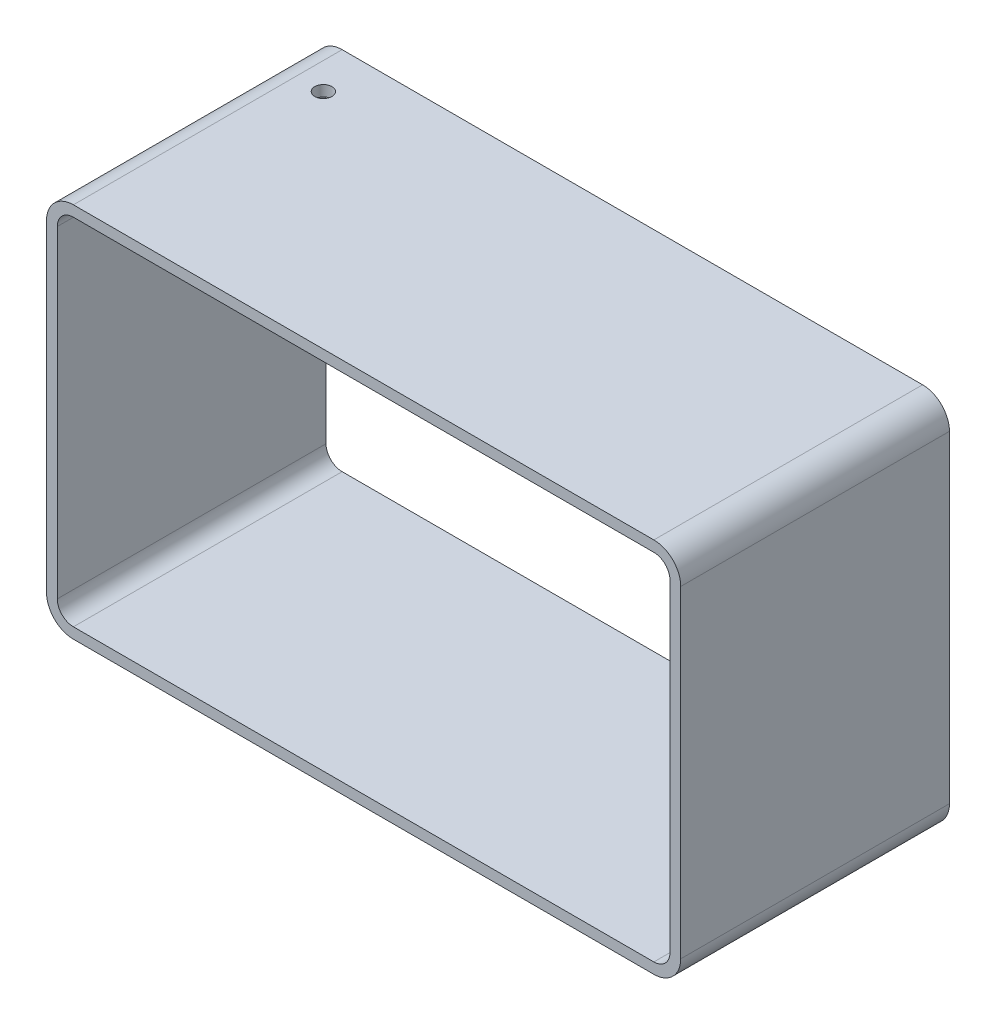
ISO-10303-21;
HEADER;
FILE_DESCRIPTION(('STEP AP214'),'2;1');
FILE_NAME('part.step','',(''),(''),'','','');
FILE_SCHEMA(('AUTOMOTIVE_DESIGN { 1 0 10303 214 1 1 1 1 }'));
ENDSEC;
DATA;
#1=APPLICATION_CONTEXT('core data for automotive mechanical design processes');
#2=APPLICATION_PROTOCOL_DEFINITION('international standard','automotive_design',2000,#1);
#3=PRODUCT_CONTEXT('',#1,'mechanical');
#4=PRODUCT('Part','Part','',(#3));
#5=PRODUCT_RELATED_PRODUCT_CATEGORY('part','',(#4));
#6=PRODUCT_DEFINITION_FORMATION('','',#4);
#7=PRODUCT_DEFINITION_CONTEXT('part definition',#1,'design');
#8=PRODUCT_DEFINITION('design','',#6,#7);
#9=PRODUCT_DEFINITION_SHAPE('','',#8);
#10=(LENGTH_UNIT() NAMED_UNIT(*) SI_UNIT(.MILLI.,.METRE.));
#11=(NAMED_UNIT(*) PLANE_ANGLE_UNIT() SI_UNIT($,.RADIAN.));
#12=(NAMED_UNIT(*) SI_UNIT($,.STERADIAN.) SOLID_ANGLE_UNIT());
#13=UNCERTAINTY_MEASURE_WITH_UNIT(LENGTH_MEASURE(1.E-05),#10,'distance_accuracy_value','');
#14=(GEOMETRIC_REPRESENTATION_CONTEXT(3) GLOBAL_UNCERTAINTY_ASSIGNED_CONTEXT((#13)) GLOBAL_UNIT_ASSIGNED_CONTEXT((#10,
#11,#12)) REPRESENTATION_CONTEXT('',''));
#15=CARTESIAN_POINT('',(0.,0.,0.));
#16=DIRECTION('',(0.,0.,1.));
#17=DIRECTION('',(1.,0.,0.));
#18=AXIS2_PLACEMENT_3D('',#15,#16,#17);
#19=CARTESIAN_POINT('',(59.,-35.,50.));
#20=DIRECTION('',(-1.,0.,0.));
#21=DIRECTION('',(0.,0.,1.));
#22=AXIS2_PLACEMENT_3D('',#19,#20,#21);
#23=PLANE('',#22);
#24=DIRECTION('',(0.,1.,0.));
#25=VECTOR('',#24,1.);
#26=CARTESIAN_POINT('',(59.,-35.,50.));
#27=LINE('',#26,#25);
#28=CARTESIAN_POINT('',(59.,-30.,50.));
#29=VERTEX_POINT('',#28);
#30=CARTESIAN_POINT('',(59.,30.,50.));
#31=VERTEX_POINT('',#30);
#32=EDGE_CURVE('E218',#29,#31,#27,.T.);
#33=ORIENTED_EDGE('',*,*,#32,.F.);
#34=DIRECTION('',(0.,0.,-1.));
#35=VECTOR('',#34,1.);
#36=CARTESIAN_POINT('',(59.,-30.,50.));
#37=LINE('',#36,#35);
#38=CARTESIAN_POINT('',(59.,-30.,0.));
#39=VERTEX_POINT('',#38);
#40=EDGE_CURVE('E243',#29,#39,#37,.T.);
#41=ORIENTED_EDGE('',*,*,#40,.T.);
#42=DIRECTION('',(0.,1.,0.));
#43=VECTOR('',#42,1.);
#44=CARTESIAN_POINT('',(59.,-35.,0.));
#45=LINE('',#44,#43);
#46=CARTESIAN_POINT('',(59.,30.,0.));
#47=VERTEX_POINT('',#46);
#48=EDGE_CURVE('E206',#39,#47,#45,.T.);
#49=ORIENTED_EDGE('',*,*,#48,.T.);
#50=DIRECTION('',(0.,0.,-1.));
#51=VECTOR('',#50,1.);
#52=CARTESIAN_POINT('',(59.,30.,50.));
#53=LINE('',#52,#51);
#54=EDGE_CURVE('E231',#47,#31,#53,.F.);
#55=ORIENTED_EDGE('',*,*,#54,.T.);
#56=EDGE_LOOP('',(#33,#41,#49,#55));
#57=FACE_BOUND('',#56,.T.);
#58=ADVANCED_FACE('F33',(#57),#23,.F.);
#59=CARTESIAN_POINT('',(-59.,35.,50.));
#60=DIRECTION('',(0.,-1.,0.));
#61=DIRECTION('',(0.,0.,-1.));
#62=AXIS2_PLACEMENT_3D('',#59,#60,#61);
#63=PLANE('',#62);
#64=CARTESIAN_POINT('',(-49.,35.,8.5));
#65=DIRECTION('',(0.,1.,0.));
#66=DIRECTION('',(0.,0.,1.));
#67=AXIS2_PLACEMENT_3D('',#64,#65,#66);
#68=CIRCLE('',#67,1.6);
#69=CARTESIAN_POINT('',(-49.,35.,10.1));
#70=VERTEX_POINT('',#69);
#71=EDGE_CURVE('E489',#70,#70,#68,.T.);
#72=ORIENTED_EDGE('',*,*,#71,.F.);
#73=EDGE_LOOP('',(#72));
#74=FACE_BOUND('',#73,.T.);
#75=DIRECTION('',(-1.,0.,0.));
#76=VECTOR('',#75,1.);
#77=CARTESIAN_POINT('',(-59.,35.,0.));
#78=LINE('',#77,#76);
#79=CARTESIAN_POINT('',(54.,35.,0.));
#80=VERTEX_POINT('',#79);
#81=CARTESIAN_POINT('',(-54.,35.,0.));
#82=VERTEX_POINT('',#81);
#83=EDGE_CURVE('E234',#80,#82,#78,.T.);
#84=ORIENTED_EDGE('',*,*,#83,.T.);
#85=DIRECTION('',(0.,0.,-1.));
#86=VECTOR('',#85,1.);
#87=CARTESIAN_POINT('',(-54.,35.,50.));
#88=LINE('',#87,#86);
#89=CARTESIAN_POINT('',(-54.,35.,50.));
#90=VERTEX_POINT('',#89);
#91=EDGE_CURVE('E11',#82,#90,#88,.F.);
#92=ORIENTED_EDGE('',*,*,#91,.T.);
#93=DIRECTION('',(-1.,0.,0.));
#94=VECTOR('',#93,1.);
#95=CARTESIAN_POINT('',(-59.,35.,50.));
#96=LINE('',#95,#94);
#97=CARTESIAN_POINT('',(54.,35.,50.));
#98=VERTEX_POINT('',#97);
#99=EDGE_CURVE('E221',#98,#90,#96,.T.);
#100=ORIENTED_EDGE('',*,*,#99,.F.);
#101=DIRECTION('',(0.,0.,-1.));
#102=VECTOR('',#101,1.);
#103=CARTESIAN_POINT('',(54.,35.,50.));
#104=LINE('',#103,#102);
#105=EDGE_CURVE('E42',#98,#80,#104,.T.);
#106=ORIENTED_EDGE('',*,*,#105,.T.);
#107=EDGE_LOOP('',(#84,#92,#100,#106));
#108=FACE_BOUND('',#107,.T.);
#109=ADVANCED_FACE('F277',(#74,#108),#63,.F.);
#110=CARTESIAN_POINT('',(-59.,-35.,50.));
#111=DIRECTION('',(1.,0.,0.));
#112=DIRECTION('',(0.,0.,-1.));
#113=AXIS2_PLACEMENT_3D('',#110,#111,#112);
#114=PLANE('',#113);
#115=DIRECTION('',(0.,-1.,0.));
#116=VECTOR('',#115,1.);
#117=CARTESIAN_POINT('',(-59.,-35.,0.));
#118=LINE('',#117,#116);
#119=CARTESIAN_POINT('',(-59.,30.,0.));
#120=VERTEX_POINT('',#119);
#121=CARTESIAN_POINT('',(-59.,-30.,0.));
#122=VERTEX_POINT('',#121);
#123=EDGE_CURVE('E237',#120,#122,#118,.T.);
#124=ORIENTED_EDGE('',*,*,#123,.T.);
#125=DIRECTION('',(0.,0.,-1.));
#126=VECTOR('',#125,1.);
#127=CARTESIAN_POINT('',(-59.,-30.,50.));
#128=LINE('',#127,#126);
#129=CARTESIAN_POINT('',(-59.,-30.,50.));
#130=VERTEX_POINT('',#129);
#131=EDGE_CURVE('E270',#122,#130,#128,.F.);
#132=ORIENTED_EDGE('',*,*,#131,.T.);
#133=DIRECTION('',(0.,-1.,0.));
#134=VECTOR('',#133,1.);
#135=CARTESIAN_POINT('',(-59.,-35.,50.));
#136=LINE('',#135,#134);
#137=CARTESIAN_POINT('',(-59.,30.,50.));
#138=VERTEX_POINT('',#137);
#139=EDGE_CURVE('E225',#138,#130,#136,.T.);
#140=ORIENTED_EDGE('',*,*,#139,.F.);
#141=DIRECTION('',(0.,0.,-1.));
#142=VECTOR('',#141,1.);
#143=CARTESIAN_POINT('',(-59.,30.,50.));
#144=LINE('',#143,#142);
#145=EDGE_CURVE('E267',#138,#120,#144,.T.);
#146=ORIENTED_EDGE('',*,*,#145,.T.);
#147=EDGE_LOOP('',(#124,#132,#140,#146));
#148=FACE_BOUND('',#147,.T.);
#149=ADVANCED_FACE('F289',(#148),#114,.F.);
#150=CARTESIAN_POINT('',(-59.,-35.,50.));
#151=DIRECTION('',(0.,1.,0.));
#152=DIRECTION('',(0.,0.,1.));
#153=AXIS2_PLACEMENT_3D('',#150,#151,#152);
#154=PLANE('',#153);
#155=CARTESIAN_POINT('',(49.,-35.,8.5));
#156=DIRECTION('',(0.,-1.,0.));
#157=DIRECTION('',(0.,0.,-1.));
#158=AXIS2_PLACEMENT_3D('',#155,#156,#157);
#159=CIRCLE('',#158,1.6);
#160=CARTESIAN_POINT('',(49.,-35.,6.9));
#161=VERTEX_POINT('',#160);
#162=EDGE_CURVE('E171',#161,#161,#159,.T.);
#163=ORIENTED_EDGE('',*,*,#162,.F.);
#164=EDGE_LOOP('',(#163));
#165=FACE_BOUND('',#164,.T.);
#166=DIRECTION('',(1.,0.,0.));
#167=VECTOR('',#166,1.);
#168=CARTESIAN_POINT('',(-59.,-35.,0.));
#169=LINE('',#168,#167);
#170=CARTESIAN_POINT('',(-54.,-35.,0.));
#171=VERTEX_POINT('',#170);
#172=CARTESIAN_POINT('',(54.,-35.,0.));
#173=VERTEX_POINT('',#172);
#174=EDGE_CURVE('E222',#171,#173,#169,.T.);
#175=ORIENTED_EDGE('',*,*,#174,.T.);
#176=DIRECTION('',(0.,0.,-1.));
#177=VECTOR('',#176,1.);
#178=CARTESIAN_POINT('',(54.,-35.,50.));
#179=LINE('',#178,#177);
#180=CARTESIAN_POINT('',(54.,-35.,50.));
#181=VERTEX_POINT('',#180);
#182=EDGE_CURVE('E257',#173,#181,#179,.F.);
#183=ORIENTED_EDGE('',*,*,#182,.T.);
#184=DIRECTION('',(1.,0.,0.));
#185=VECTOR('',#184,1.);
#186=CARTESIAN_POINT('',(-59.,-35.,50.));
#187=LINE('',#186,#185);
#188=CARTESIAN_POINT('',(-54.,-35.,50.));
#189=VERTEX_POINT('',#188);
#190=EDGE_CURVE('E228',#189,#181,#187,.T.);
#191=ORIENTED_EDGE('',*,*,#190,.F.);
#192=DIRECTION('',(0.,0.,-1.));
#193=VECTOR('',#192,1.);
#194=CARTESIAN_POINT('',(-54.,-35.,50.));
#195=LINE('',#194,#193);
#196=EDGE_CURVE('E254',#189,#171,#195,.T.);
#197=ORIENTED_EDGE('',*,*,#196,.T.);
#198=EDGE_LOOP('',(#175,#183,#191,#197));
#199=FACE_BOUND('',#198,.T.);
#200=ADVANCED_FACE('F300',(#165,#199),#154,.F.);
#201=CARTESIAN_POINT('',(0.,0.,50.));
#202=DIRECTION('',(0.,0.,-1.));
#203=DIRECTION('',(-1.,0.,0.));
#204=AXIS2_PLACEMENT_3D('',#201,#202,#203);
#205=PLANE('',#204);
#206=DIRECTION('',(1.,0.,0.));
#207=VECTOR('',#206,1.);
#208=CARTESIAN_POINT('',(-54.,-33.,50.));
#209=LINE('',#208,#207);
#210=CARTESIAN_POINT('',(-54.,-33.,50.));
#211=VERTEX_POINT('',#210);
#212=CARTESIAN_POINT('',(54.,-33.,50.));
#213=VERTEX_POINT('',#212);
#214=EDGE_CURVE('E188',#211,#213,#209,.T.);
#215=ORIENTED_EDGE('',*,*,#214,.F.);
#216=CARTESIAN_POINT('',(-54.,-30.,50.));
#217=DIRECTION('',(0.,0.,1.));
#218=DIRECTION('',(1.,0.,0.));
#219=AXIS2_PLACEMENT_3D('',#216,#217,#218);
#220=CIRCLE('',#219,3.);
#221=CARTESIAN_POINT('',(-57.,-30.,50.));
#222=VERTEX_POINT('',#221);
#223=EDGE_CURVE('E49',#222,#211,#220,.T.);
#224=ORIENTED_EDGE('',*,*,#223,.F.);
#225=DIRECTION('',(0.,-1.,0.));
#226=VECTOR('',#225,1.);
#227=CARTESIAN_POINT('',(-57.,30.,50.));
#228=LINE('',#227,#226);
#229=CARTESIAN_POINT('',(-57.,30.,50.));
#230=VERTEX_POINT('',#229);
#231=EDGE_CURVE('E165',#230,#222,#228,.T.);
#232=ORIENTED_EDGE('',*,*,#231,.F.);
#233=CARTESIAN_POINT('',(-54.,30.,50.));
#234=DIRECTION('',(0.,0.,1.));
#235=DIRECTION('',(1.,0.,0.));
#236=AXIS2_PLACEMENT_3D('',#233,#234,#235);
#237=CIRCLE('',#236,3.);
#238=CARTESIAN_POINT('',(-54.,33.,50.));
#239=VERTEX_POINT('',#238);
#240=EDGE_CURVE('E168',#239,#230,#237,.T.);
#241=ORIENTED_EDGE('',*,*,#240,.F.);
#242=DIRECTION('',(-1.,0.,0.));
#243=VECTOR('',#242,1.);
#244=CARTESIAN_POINT('',(54.,33.,50.));
#245=LINE('',#244,#243);
#246=CARTESIAN_POINT('',(54.,33.,50.));
#247=VERTEX_POINT('',#246);
#248=EDGE_CURVE('E199',#247,#239,#245,.T.);
#249=ORIENTED_EDGE('',*,*,#248,.F.);
#250=CARTESIAN_POINT('',(54.,30.,50.));
#251=DIRECTION('',(0.,0.,1.));
#252=DIRECTION('',(1.,0.,0.));
#253=AXIS2_PLACEMENT_3D('',#250,#251,#252);
#254=CIRCLE('',#253,3.);
#255=CARTESIAN_POINT('',(57.,30.,50.));
#256=VERTEX_POINT('',#255);
#257=EDGE_CURVE('E196',#256,#247,#254,.T.);
#258=ORIENTED_EDGE('',*,*,#257,.F.);
#259=DIRECTION('',(0.,1.,0.));
#260=VECTOR('',#259,1.);
#261=CARTESIAN_POINT('',(57.,-30.,50.));
#262=LINE('',#261,#260);
#263=CARTESIAN_POINT('',(57.,-30.,50.));
#264=VERTEX_POINT('',#263);
#265=EDGE_CURVE('E193',#264,#256,#262,.T.);
#266=ORIENTED_EDGE('',*,*,#265,.F.);
#267=CARTESIAN_POINT('',(54.,-30.,50.));
#268=DIRECTION('',(0.,0.,1.));
#269=DIRECTION('',(1.,0.,0.));
#270=AXIS2_PLACEMENT_3D('',#267,#268,#269);
#271=CIRCLE('',#270,3.);
#272=EDGE_CURVE('E190',#213,#264,#271,.T.);
#273=ORIENTED_EDGE('',*,*,#272,.F.);
#274=EDGE_LOOP('',(#215,#224,#232,#241,#249,#258,#266,#273));
#275=FACE_BOUND('',#274,.T.);
#276=ORIENTED_EDGE('',*,*,#190,.T.);
#277=CARTESIAN_POINT('',(54.,-30.,50.));
#278=DIRECTION('',(0.,0.,-1.));
#279=DIRECTION('',(-1.,0.,0.));
#280=AXIS2_PLACEMENT_3D('',#277,#278,#279);
#281=CIRCLE('',#280,5.);
#282=EDGE_CURVE('E265',#181,#29,#281,.F.);
#283=ORIENTED_EDGE('',*,*,#282,.T.);
#284=ORIENTED_EDGE('',*,*,#32,.T.);
#285=CARTESIAN_POINT('',(54.,30.,50.));
#286=DIRECTION('',(0.,0.,-1.));
#287=DIRECTION('',(-1.,0.,0.));
#288=AXIS2_PLACEMENT_3D('',#285,#286,#287);
#289=CIRCLE('',#288,5.);
#290=EDGE_CURVE('E259',#31,#98,#289,.F.);
#291=ORIENTED_EDGE('',*,*,#290,.T.);
#292=ORIENTED_EDGE('',*,*,#99,.T.);
#293=CARTESIAN_POINT('',(-54.,30.,50.));
#294=DIRECTION('',(0.,0.,-1.));
#295=DIRECTION('',(-1.,0.,0.));
#296=AXIS2_PLACEMENT_3D('',#293,#294,#295);
#297=CIRCLE('',#296,5.);
#298=EDGE_CURVE('E261',#90,#138,#297,.F.);
#299=ORIENTED_EDGE('',*,*,#298,.T.);
#300=ORIENTED_EDGE('',*,*,#139,.T.);
#301=CARTESIAN_POINT('',(-54.,-30.,50.));
#302=DIRECTION('',(0.,0.,-1.));
#303=DIRECTION('',(-1.,0.,0.));
#304=AXIS2_PLACEMENT_3D('',#301,#302,#303);
#305=CIRCLE('',#304,5.);
#306=EDGE_CURVE('E263',#130,#189,#305,.F.);
#307=ORIENTED_EDGE('',*,*,#306,.T.);
#308=EDGE_LOOP('',(#276,#283,#284,#291,#292,#299,#300,#307));
#309=FACE_BOUND('',#308,.T.);
#310=ADVANCED_FACE('F293',(#275,#309),#205,.F.);
#311=CARTESIAN_POINT('',(0.,0.,0.));
#312=DIRECTION('',(0.,0.,-1.));
#313=DIRECTION('',(-1.,0.,0.));
#314=AXIS2_PLACEMENT_3D('',#311,#312,#313);
#315=PLANE('',#314);
#316=CARTESIAN_POINT('',(-54.,-30.,0.));
#317=DIRECTION('',(0.,0.,1.));
#318=DIRECTION('',(1.,0.,0.));
#319=AXIS2_PLACEMENT_3D('',#316,#317,#318);
#320=CIRCLE('',#319,3.);
#321=CARTESIAN_POINT('',(-57.,-30.,0.));
#322=VERTEX_POINT('',#321);
#323=CARTESIAN_POINT('',(-54.,-33.,0.));
#324=VERTEX_POINT('',#323);
#325=EDGE_CURVE('E148',#322,#324,#320,.T.);
#326=ORIENTED_EDGE('',*,*,#325,.T.);
#327=DIRECTION('',(1.,0.,0.));
#328=VECTOR('',#327,1.);
#329=CARTESIAN_POINT('',(-54.,-33.,0.));
#330=LINE('',#329,#328);
#331=CARTESIAN_POINT('',(54.,-33.,0.));
#332=VERTEX_POINT('',#331);
#333=EDGE_CURVE('E157',#324,#332,#330,.T.);
#334=ORIENTED_EDGE('',*,*,#333,.T.);
#335=CARTESIAN_POINT('',(54.,-30.,0.));
#336=DIRECTION('',(0.,0.,1.));
#337=DIRECTION('',(1.,0.,0.));
#338=AXIS2_PLACEMENT_3D('',#335,#336,#337);
#339=CIRCLE('',#338,3.);
#340=CARTESIAN_POINT('',(57.,-30.,0.));
#341=VERTEX_POINT('',#340);
#342=EDGE_CURVE('E57',#332,#341,#339,.T.);
#343=ORIENTED_EDGE('',*,*,#342,.T.);
#344=DIRECTION('',(0.,1.,0.));
#345=VECTOR('',#344,1.);
#346=CARTESIAN_POINT('',(57.,-30.,0.));
#347=LINE('',#346,#345);
#348=CARTESIAN_POINT('',(57.,30.,0.));
#349=VERTEX_POINT('',#348);
#350=EDGE_CURVE('E175',#341,#349,#347,.T.);
#351=ORIENTED_EDGE('',*,*,#350,.T.);
#352=CARTESIAN_POINT('',(54.,30.,0.));
#353=DIRECTION('',(0.,0.,1.));
#354=DIRECTION('',(1.,0.,0.));
#355=AXIS2_PLACEMENT_3D('',#352,#353,#354);
#356=CIRCLE('',#355,3.);
#357=CARTESIAN_POINT('',(54.,33.,0.));
#358=VERTEX_POINT('',#357);
#359=EDGE_CURVE('E178',#349,#358,#356,.T.);
#360=ORIENTED_EDGE('',*,*,#359,.T.);
#361=DIRECTION('',(-1.,0.,0.));
#362=VECTOR('',#361,1.);
#363=CARTESIAN_POINT('',(54.,33.,0.));
#364=LINE('',#363,#362);
#365=CARTESIAN_POINT('',(-54.,33.,0.));
#366=VERTEX_POINT('',#365);
#367=EDGE_CURVE('E181',#358,#366,#364,.T.);
#368=ORIENTED_EDGE('',*,*,#367,.T.);
#369=CARTESIAN_POINT('',(-54.,30.,0.));
#370=DIRECTION('',(0.,0.,1.));
#371=DIRECTION('',(1.,0.,0.));
#372=AXIS2_PLACEMENT_3D('',#369,#370,#371);
#373=CIRCLE('',#372,3.);
#374=CARTESIAN_POINT('',(-57.,30.,0.));
#375=VERTEX_POINT('',#374);
#376=EDGE_CURVE('E184',#366,#375,#373,.T.);
#377=ORIENTED_EDGE('',*,*,#376,.T.);
#378=DIRECTION('',(0.,-1.,0.));
#379=VECTOR('',#378,1.);
#380=CARTESIAN_POINT('',(-57.,30.,0.));
#381=LINE('',#380,#379);
#382=EDGE_CURVE('E154',#375,#322,#381,.T.);
#383=ORIENTED_EDGE('',*,*,#382,.T.);
#384=EDGE_LOOP('',(#326,#334,#343,#351,#360,#368,#377,#383));
#385=FACE_BOUND('',#384,.T.);
#386=ORIENTED_EDGE('',*,*,#48,.F.);
#387=CARTESIAN_POINT('',(54.,-30.,0.));
#388=DIRECTION('',(0.,0.,-1.));
#389=DIRECTION('',(-1.,0.,0.));
#390=AXIS2_PLACEMENT_3D('',#387,#388,#389);
#391=CIRCLE('',#390,5.);
#392=EDGE_CURVE('E252',#39,#173,#391,.T.);
#393=ORIENTED_EDGE('',*,*,#392,.T.);
#394=ORIENTED_EDGE('',*,*,#174,.F.);
#395=CARTESIAN_POINT('',(-54.,-30.,0.));
#396=DIRECTION('',(0.,0.,-1.));
#397=DIRECTION('',(-1.,0.,0.));
#398=AXIS2_PLACEMENT_3D('',#395,#396,#397);
#399=CIRCLE('',#398,5.);
#400=EDGE_CURVE('E250',#171,#122,#399,.T.);
#401=ORIENTED_EDGE('',*,*,#400,.T.);
#402=ORIENTED_EDGE('',*,*,#123,.F.);
#403=CARTESIAN_POINT('',(-54.,30.,0.));
#404=DIRECTION('',(0.,0.,-1.));
#405=DIRECTION('',(-1.,0.,0.));
#406=AXIS2_PLACEMENT_3D('',#403,#404,#405);
#407=CIRCLE('',#406,5.);
#408=EDGE_CURVE('E248',#120,#82,#407,.T.);
#409=ORIENTED_EDGE('',*,*,#408,.T.);
#410=ORIENTED_EDGE('',*,*,#83,.F.);
#411=CARTESIAN_POINT('',(54.,30.,0.));
#412=DIRECTION('',(0.,0.,-1.));
#413=DIRECTION('',(-1.,0.,0.));
#414=AXIS2_PLACEMENT_3D('',#411,#412,#413);
#415=CIRCLE('',#414,5.);
#416=EDGE_CURVE('E246',#80,#47,#415,.T.);
#417=ORIENTED_EDGE('',*,*,#416,.T.);
#418=EDGE_LOOP('',(#386,#393,#394,#401,#402,#409,#410,#417));
#419=FACE_BOUND('',#418,.T.);
#420=ADVANCED_FACE('F161',(#385,#419),#315,.T.);
#421=CARTESIAN_POINT('',(54.,-30.,50.));
#422=DIRECTION('',(0.,0.,-1.));
#423=DIRECTION('',(-1.,0.,0.));
#424=AXIS2_PLACEMENT_3D('',#421,#422,#423);
#425=CYLINDRICAL_SURFACE('',#424,5.);
#426=ORIENTED_EDGE('',*,*,#282,.F.);
#427=ORIENTED_EDGE('',*,*,#182,.F.);
#428=ORIENTED_EDGE('',*,*,#392,.F.);
#429=ORIENTED_EDGE('',*,*,#40,.F.);
#430=EDGE_LOOP('',(#426,#427,#428,#429));
#431=FACE_BOUND('',#430,.T.);
#432=ADVANCED_FACE('F305',(#431),#425,.T.);
#433=CARTESIAN_POINT('',(-54.,-30.,50.));
#434=DIRECTION('',(0.,0.,-1.));
#435=DIRECTION('',(-1.,0.,0.));
#436=AXIS2_PLACEMENT_3D('',#433,#434,#435);
#437=CYLINDRICAL_SURFACE('',#436,5.);
#438=ORIENTED_EDGE('',*,*,#306,.F.);
#439=ORIENTED_EDGE('',*,*,#131,.F.);
#440=ORIENTED_EDGE('',*,*,#400,.F.);
#441=ORIENTED_EDGE('',*,*,#196,.F.);
#442=EDGE_LOOP('',(#438,#439,#440,#441));
#443=FACE_BOUND('',#442,.T.);
#444=ADVANCED_FACE('F297',(#443),#437,.T.);
#445=CARTESIAN_POINT('',(-54.,30.,50.));
#446=DIRECTION('',(0.,0.,-1.));
#447=DIRECTION('',(-1.,0.,0.));
#448=AXIS2_PLACEMENT_3D('',#445,#446,#447);
#449=CYLINDRICAL_SURFACE('',#448,5.);
#450=ORIENTED_EDGE('',*,*,#298,.F.);
#451=ORIENTED_EDGE('',*,*,#91,.F.);
#452=ORIENTED_EDGE('',*,*,#408,.F.);
#453=ORIENTED_EDGE('',*,*,#145,.F.);
#454=EDGE_LOOP('',(#450,#451,#452,#453));
#455=FACE_BOUND('',#454,.T.);
#456=ADVANCED_FACE('F286',(#455),#449,.T.);
#457=CARTESIAN_POINT('',(54.,30.,50.));
#458=DIRECTION('',(0.,0.,-1.));
#459=DIRECTION('',(-1.,0.,0.));
#460=AXIS2_PLACEMENT_3D('',#457,#458,#459);
#461=CYLINDRICAL_SURFACE('',#460,5.);
#462=ORIENTED_EDGE('',*,*,#290,.F.);
#463=ORIENTED_EDGE('',*,*,#54,.F.);
#464=ORIENTED_EDGE('',*,*,#416,.F.);
#465=ORIENTED_EDGE('',*,*,#105,.F.);
#466=EDGE_LOOP('',(#462,#463,#464,#465));
#467=FACE_BOUND('',#466,.T.);
#468=ADVANCED_FACE('F35',(#467),#461,.T.);
#469=CARTESIAN_POINT('',(-54.,-30.,0.));
#470=DIRECTION('',(0.,0.,1.));
#471=DIRECTION('',(1.,0.,0.));
#472=AXIS2_PLACEMENT_3D('',#469,#470,#471);
#473=CYLINDRICAL_SURFACE('',#472,3.);
#474=ORIENTED_EDGE('',*,*,#223,.T.);
#475=DIRECTION('',(0.,0.,1.));
#476=VECTOR('',#475,1.);
#477=CARTESIAN_POINT('',(-54.,-33.,0.));
#478=LINE('',#477,#476);
#479=EDGE_CURVE('E144',#324,#211,#478,.T.);
#480=ORIENTED_EDGE('',*,*,#479,.F.);
#481=ORIENTED_EDGE('',*,*,#325,.F.);
#482=DIRECTION('',(0.,0.,1.));
#483=VECTOR('',#482,1.);
#484=CARTESIAN_POINT('',(-57.,-30.,0.));
#485=LINE('',#484,#483);
#486=EDGE_CURVE('E204',#322,#222,#485,.T.);
#487=ORIENTED_EDGE('',*,*,#486,.T.);
#488=EDGE_LOOP('',(#474,#480,#481,#487));
#489=FACE_BOUND('',#488,.T.);
#490=ADVANCED_FACE('F146',(#489),#473,.F.);
#491=CARTESIAN_POINT('',(-57.,30.,0.));
#492=DIRECTION('',(-1.,0.,0.));
#493=DIRECTION('',(0.,-1.,0.));
#494=AXIS2_PLACEMENT_3D('',#491,#492,#493);
#495=PLANE('',#494);
#496=ORIENTED_EDGE('',*,*,#231,.T.);
#497=ORIENTED_EDGE('',*,*,#486,.F.);
#498=ORIENTED_EDGE('',*,*,#382,.F.);
#499=DIRECTION('',(0.,0.,1.));
#500=VECTOR('',#499,1.);
#501=CARTESIAN_POINT('',(-57.,30.,0.));
#502=LINE('',#501,#500);
#503=EDGE_CURVE('E207',#375,#230,#502,.T.);
#504=ORIENTED_EDGE('',*,*,#503,.T.);
#505=EDGE_LOOP('',(#496,#497,#498,#504));
#506=FACE_BOUND('',#505,.T.);
#507=ADVANCED_FACE('F314',(#506),#495,.F.);
#508=CARTESIAN_POINT('',(-54.,30.,0.));
#509=DIRECTION('',(0.,0.,1.));
#510=DIRECTION('',(1.,0.,0.));
#511=AXIS2_PLACEMENT_3D('',#508,#509,#510);
#512=CYLINDRICAL_SURFACE('',#511,3.);
#513=ORIENTED_EDGE('',*,*,#240,.T.);
#514=ORIENTED_EDGE('',*,*,#503,.F.);
#515=ORIENTED_EDGE('',*,*,#376,.F.);
#516=DIRECTION('',(0.,0.,1.));
#517=VECTOR('',#516,1.);
#518=CARTESIAN_POINT('',(-54.,33.,0.));
#519=LINE('',#518,#517);
#520=EDGE_CURVE('E209',#366,#239,#519,.T.);
#521=ORIENTED_EDGE('',*,*,#520,.T.);
#522=EDGE_LOOP('',(#513,#514,#515,#521));
#523=FACE_BOUND('',#522,.T.);
#524=ADVANCED_FACE('F375',(#523),#512,.F.);
#525=CARTESIAN_POINT('',(54.,33.,0.));
#526=DIRECTION('',(0.,1.,0.));
#527=DIRECTION('',(0.,0.,1.));
#528=AXIS2_PLACEMENT_3D('',#525,#526,#527);
#529=PLANE('',#528);
#530=CARTESIAN_POINT('',(-49.,33.,8.5));
#531=DIRECTION('',(0.,1.,0.));
#532=DIRECTION('',(0.,0.,1.));
#533=AXIS2_PLACEMENT_3D('',#530,#531,#532);
#534=CIRCLE('',#533,1.6);
#535=CARTESIAN_POINT('',(-49.,33.,10.1));
#536=VERTEX_POINT('',#535);
#537=EDGE_CURVE('E37',#536,#536,#534,.T.);
#538=ORIENTED_EDGE('',*,*,#537,.T.);
#539=EDGE_LOOP('',(#538));
#540=FACE_BOUND('',#539,.T.);
#541=ORIENTED_EDGE('',*,*,#248,.T.);
#542=ORIENTED_EDGE('',*,*,#520,.F.);
#543=ORIENTED_EDGE('',*,*,#367,.F.);
#544=DIRECTION('',(0.,0.,1.));
#545=VECTOR('',#544,1.);
#546=CARTESIAN_POINT('',(54.,33.,0.));
#547=LINE('',#546,#545);
#548=EDGE_CURVE('E211',#358,#247,#547,.T.);
#549=ORIENTED_EDGE('',*,*,#548,.T.);
#550=EDGE_LOOP('',(#541,#542,#543,#549));
#551=FACE_BOUND('',#550,.T.);
#552=ADVANCED_FACE('F385',(#540,#551),#529,.F.);
#553=CARTESIAN_POINT('',(54.,30.,0.));
#554=DIRECTION('',(0.,0.,1.));
#555=DIRECTION('',(1.,0.,0.));
#556=AXIS2_PLACEMENT_3D('',#553,#554,#555);
#557=CYLINDRICAL_SURFACE('',#556,3.);
#558=ORIENTED_EDGE('',*,*,#257,.T.);
#559=ORIENTED_EDGE('',*,*,#548,.F.);
#560=ORIENTED_EDGE('',*,*,#359,.F.);
#561=DIRECTION('',(0.,0.,1.));
#562=VECTOR('',#561,1.);
#563=CARTESIAN_POINT('',(57.,30.,0.));
#564=LINE('',#563,#562);
#565=EDGE_CURVE('E213',#349,#256,#564,.T.);
#566=ORIENTED_EDGE('',*,*,#565,.T.);
#567=EDGE_LOOP('',(#558,#559,#560,#566));
#568=FACE_BOUND('',#567,.T.);
#569=ADVANCED_FACE('F393',(#568),#557,.F.);
#570=CARTESIAN_POINT('',(57.,-30.,0.));
#571=DIRECTION('',(1.,0.,0.));
#572=DIRECTION('',(0.,1.,0.));
#573=AXIS2_PLACEMENT_3D('',#570,#571,#572);
#574=PLANE('',#573);
#575=ORIENTED_EDGE('',*,*,#265,.T.);
#576=ORIENTED_EDGE('',*,*,#565,.F.);
#577=ORIENTED_EDGE('',*,*,#350,.F.);
#578=DIRECTION('',(0.,0.,1.));
#579=VECTOR('',#578,1.);
#580=CARTESIAN_POINT('',(57.,-30.,0.));
#581=LINE('',#580,#579);
#582=EDGE_CURVE('E215',#341,#264,#581,.T.);
#583=ORIENTED_EDGE('',*,*,#582,.T.);
#584=EDGE_LOOP('',(#575,#576,#577,#583));
#585=FACE_BOUND('',#584,.T.);
#586=ADVANCED_FACE('F398',(#585),#574,.F.);
#587=CARTESIAN_POINT('',(54.,-30.,0.));
#588=DIRECTION('',(0.,0.,1.));
#589=DIRECTION('',(1.,0.,0.));
#590=AXIS2_PLACEMENT_3D('',#587,#588,#589);
#591=CYLINDRICAL_SURFACE('',#590,3.);
#592=ORIENTED_EDGE('',*,*,#272,.T.);
#593=ORIENTED_EDGE('',*,*,#582,.F.);
#594=ORIENTED_EDGE('',*,*,#342,.F.);
#595=DIRECTION('',(0.,0.,1.));
#596=VECTOR('',#595,1.);
#597=CARTESIAN_POINT('',(54.,-33.,0.));
#598=LINE('',#597,#596);
#599=EDGE_CURVE('E153',#332,#213,#598,.T.);
#600=ORIENTED_EDGE('',*,*,#599,.T.);
#601=EDGE_LOOP('',(#592,#593,#594,#600));
#602=FACE_BOUND('',#601,.T.);
#603=ADVANCED_FACE('F408',(#602),#591,.F.);
#604=CARTESIAN_POINT('',(-54.,-33.,0.));
#605=DIRECTION('',(0.,-1.,0.));
#606=DIRECTION('',(0.,0.,-1.));
#607=AXIS2_PLACEMENT_3D('',#604,#605,#606);
#608=PLANE('',#607);
#609=CARTESIAN_POINT('',(49.,-33.,8.5));
#610=DIRECTION('',(0.,-1.,0.));
#611=DIRECTION('',(0.,0.,-1.));
#612=AXIS2_PLACEMENT_3D('',#609,#610,#611);
#613=CIRCLE('',#612,1.6);
#614=CARTESIAN_POINT('',(49.,-33.,6.9));
#615=VERTEX_POINT('',#614);
#616=EDGE_CURVE('E492',#615,#615,#613,.F.);
#617=ORIENTED_EDGE('',*,*,#616,.F.);
#618=EDGE_LOOP('',(#617));
#619=FACE_BOUND('',#618,.T.);
#620=ORIENTED_EDGE('',*,*,#214,.T.);
#621=ORIENTED_EDGE('',*,*,#599,.F.);
#622=ORIENTED_EDGE('',*,*,#333,.F.);
#623=ORIENTED_EDGE('',*,*,#479,.T.);
#624=EDGE_LOOP('',(#620,#621,#622,#623));
#625=FACE_BOUND('',#624,.T.);
#626=ADVANCED_FACE('F158',(#619,#625),#608,.F.);
#627=CARTESIAN_POINT('',(49.,35.001,8.5));
#628=DIRECTION('',(0.,-1.,0.));
#629=DIRECTION('',(0.,0.,-1.));
#630=AXIS2_PLACEMENT_3D('',#627,#628,#629);
#631=CYLINDRICAL_SURFACE('',#630,1.6);
#632=ORIENTED_EDGE('',*,*,#162,.T.);
#633=EDGE_LOOP('',(#632));
#634=FACE_BOUND('',#633,.T.);
#635=ORIENTED_EDGE('',*,*,#616,.T.);
#636=EDGE_LOOP('',(#635));
#637=FACE_BOUND('',#636,.T.);
#638=ADVANCED_FACE('F435',(#634,#637),#631,.F.);
#639=CARTESIAN_POINT('',(-49.,-15.,8.5));
#640=DIRECTION('',(0.,1.,0.));
#641=DIRECTION('',(0.,0.,1.));
#642=AXIS2_PLACEMENT_3D('',#639,#640,#641);
#643=CYLINDRICAL_SURFACE('',#642,1.6);
#644=ORIENTED_EDGE('',*,*,#71,.T.);
#645=EDGE_LOOP('',(#644));
#646=FACE_BOUND('',#645,.T.);
#647=ORIENTED_EDGE('',*,*,#537,.F.);
#648=EDGE_LOOP('',(#647));
#649=FACE_BOUND('',#648,.T.);
#650=ADVANCED_FACE('F445',(#646,#649),#643,.F.);
#651=CLOSED_SHELL('',(#58,#109,#149,#200,#310,#420,#432,#444,#456,#468,#490,#507,#524,#552,#569,
#586,#603,#626,#638,#650));
#652=MANIFOLD_SOLID_BREP('B2',#651);
#653=ADVANCED_BREP_SHAPE_REPRESENTATION('',(#18,#652),#14);
#654=SHAPE_DEFINITION_REPRESENTATION(#9,#653);
ENDSEC;
END-ISO-10303-21;
